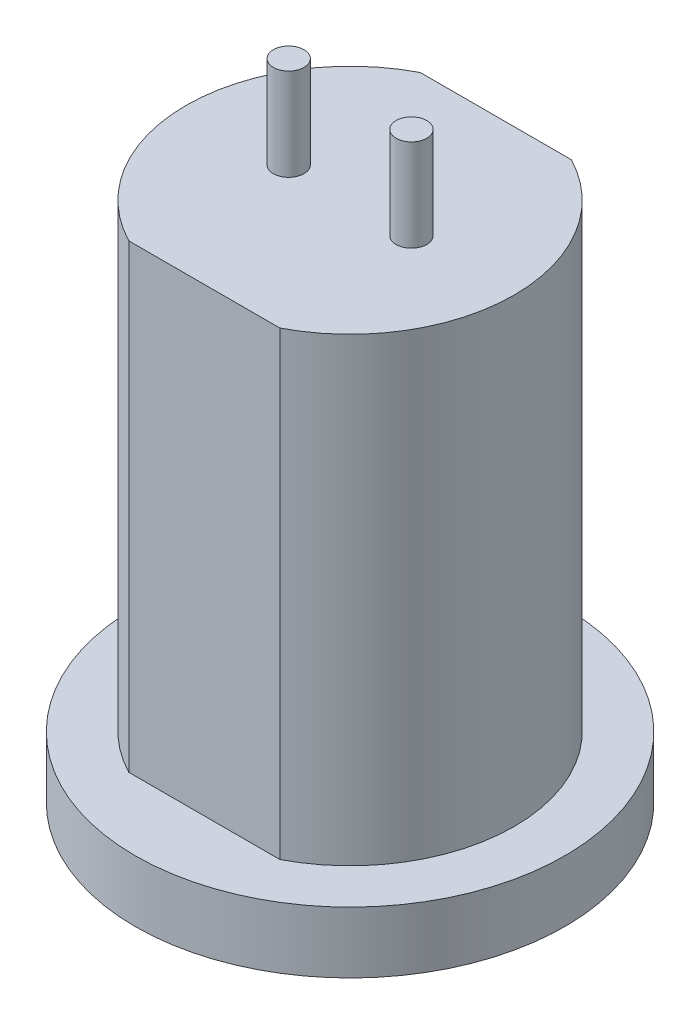
ISO-10303-21;
HEADER;
FILE_DESCRIPTION(('STEP AP214'),'2;1');
FILE_NAME('part.step','',(''),(''),'','','');
FILE_SCHEMA(('AUTOMOTIVE_DESIGN { 1 0 10303 214 1 1 1 1 }'));
ENDSEC;
DATA;
#1=APPLICATION_CONTEXT('core data for automotive mechanical design processes');
#2=APPLICATION_PROTOCOL_DEFINITION('international standard','automotive_design',2000,#1);
#3=PRODUCT_CONTEXT('',#1,'mechanical');
#4=PRODUCT('Part','Part','',(#3));
#5=PRODUCT_RELATED_PRODUCT_CATEGORY('part','',(#4));
#6=PRODUCT_DEFINITION_FORMATION('','',#4);
#7=PRODUCT_DEFINITION_CONTEXT('part definition',#1,'design');
#8=PRODUCT_DEFINITION('design','',#6,#7);
#9=PRODUCT_DEFINITION_SHAPE('','',#8);
#10=(LENGTH_UNIT() NAMED_UNIT(*) SI_UNIT(.MILLI.,.METRE.));
#11=(NAMED_UNIT(*) PLANE_ANGLE_UNIT() SI_UNIT($,.RADIAN.));
#12=(NAMED_UNIT(*) SI_UNIT($,.STERADIAN.) SOLID_ANGLE_UNIT());
#13=UNCERTAINTY_MEASURE_WITH_UNIT(LENGTH_MEASURE(1.E-05),#10,'distance_accuracy_value','');
#14=(GEOMETRIC_REPRESENTATION_CONTEXT(3) GLOBAL_UNCERTAINTY_ASSIGNED_CONTEXT((#13)) GLOBAL_UNIT_ASSIGNED_CONTEXT((#10,
#11,#12)) REPRESENTATION_CONTEXT('',''));
#15=CARTESIAN_POINT('',(0.,0.,0.));
#16=DIRECTION('',(0.,0.,1.));
#17=DIRECTION('',(1.,0.,0.));
#18=AXIS2_PLACEMENT_3D('',#15,#16,#17);
#19=CARTESIAN_POINT('',(0.,2.,0.));
#20=DIRECTION('',(0.,-1.,0.));
#21=DIRECTION('',(0.,0.,-1.));
#22=AXIS2_PLACEMENT_3D('',#19,#20,#21);
#23=CYLINDRICAL_SURFACE('',#22,7.);
#24=CARTESIAN_POINT('',(0.,2.,0.));
#25=DIRECTION('',(0.,1.,0.));
#26=DIRECTION('',(0.,0.,1.));
#27=AXIS2_PLACEMENT_3D('',#24,#25,#26);
#28=CIRCLE('',#27,7.);
#29=CARTESIAN_POINT('',(0.,2.,7.));
#30=VERTEX_POINT('',#29);
#31=EDGE_CURVE('E11',#30,#30,#28,.T.);
#32=ORIENTED_EDGE('',*,*,#31,.F.);
#33=EDGE_LOOP('',(#32));
#34=FACE_BOUND('',#33,.T.);
#35=CARTESIAN_POINT('',(0.,0.,0.));
#36=DIRECTION('',(0.,1.,0.));
#37=DIRECTION('',(0.,0.,1.));
#38=AXIS2_PLACEMENT_3D('',#35,#36,#37);
#39=CIRCLE('',#38,7.);
#40=CARTESIAN_POINT('',(0.,0.,7.));
#41=VERTEX_POINT('',#40);
#42=EDGE_CURVE('E42',#41,#41,#39,.T.);
#43=ORIENTED_EDGE('',*,*,#42,.T.);
#44=EDGE_LOOP('',(#43));
#45=FACE_BOUND('',#44,.T.);
#46=ADVANCED_FACE('F39',(#34,#45),#23,.T.);
#47=CARTESIAN_POINT('',(0.,2.,0.));
#48=DIRECTION('',(0.,1.,0.));
#49=DIRECTION('',(0.,0.,1.));
#50=AXIS2_PLACEMENT_3D('',#47,#48,#49);
#51=PLANE('',#50);
#52=CARTESIAN_POINT('',(0.,2.,0.));
#53=DIRECTION('',(0.,1.,0.));
#54=DIRECTION('',(0.,0.,1.));
#55=AXIS2_PLACEMENT_3D('',#52,#53,#54);
#56=CIRCLE('',#55,5.35);
#57=CARTESIAN_POINT('',(2.46170672501823,2.,4.74999999999999));
#58=VERTEX_POINT('',#57);
#59=CARTESIAN_POINT('',(2.46170672501819,2.,-4.75000000000001));
#60=VERTEX_POINT('',#59);
#61=EDGE_CURVE('E61',#58,#60,#56,.T.);
#62=ORIENTED_EDGE('',*,*,#61,.F.);
#63=DIRECTION('',(1.,0.,0.));
#64=VECTOR('',#63,1.);
#65=CARTESIAN_POINT('',(0.,2.,4.74999999999997));
#66=LINE('',#65,#64);
#67=CARTESIAN_POINT('',(-2.46170672501825,1.99999999999997,4.74999999999998));
#68=VERTEX_POINT('',#67);
#69=EDGE_CURVE('E158',#68,#58,#66,.T.);
#70=ORIENTED_EDGE('',*,*,#69,.F.);
#71=CARTESIAN_POINT('',(-2.46170672501825,2.00000000000003,-4.75000000000003));
#72=VERTEX_POINT('',#71);
#73=EDGE_CURVE('E167',#72,#68,#56,.T.);
#74=ORIENTED_EDGE('',*,*,#73,.F.);
#75=DIRECTION('',(1.,0.,0.));
#76=VECTOR('',#75,1.);
#77=CARTESIAN_POINT('',(0.,2.00000000000017,-4.75));
#78=LINE('',#77,#76);
#79=EDGE_CURVE('E166',#72,#60,#78,.T.);
#80=ORIENTED_EDGE('',*,*,#79,.T.);
#81=EDGE_LOOP('',(#62,#70,#74,#80));
#82=FACE_BOUND('',#81,.T.);
#83=ORIENTED_EDGE('',*,*,#31,.T.);
#84=EDGE_LOOP('',(#83));
#85=FACE_BOUND('',#84,.T.);
#86=ADVANCED_FACE('F187',(#82,#85),#51,.T.);
#87=CARTESIAN_POINT('',(0.,0.,0.));
#88=DIRECTION('',(0.,1.,0.));
#89=DIRECTION('',(0.,0.,1.));
#90=AXIS2_PLACEMENT_3D('',#87,#88,#89);
#91=PLANE('',#90);
#92=DIRECTION('',(1.,0.,0.));
#93=VECTOR('',#92,1.);
#94=CARTESIAN_POINT('',(-2.5,0.,-1.5));
#95=LINE('',#94,#93);
#96=CARTESIAN_POINT('',(-2.5,0.,-1.5));
#97=VERTEX_POINT('',#96);
#98=CARTESIAN_POINT('',(2.5,0.,-1.5));
#99=VERTEX_POINT('',#98);
#100=EDGE_CURVE('E134',#97,#99,#95,.T.);
#101=ORIENTED_EDGE('',*,*,#100,.F.);
#102=CARTESIAN_POINT('',(-2.5,0.,0.));
#103=DIRECTION('',(0.,-1.,0.));
#104=DIRECTION('',(0.,0.,-1.));
#105=AXIS2_PLACEMENT_3D('',#102,#103,#104);
#106=CIRCLE('',#105,1.5);
#107=CARTESIAN_POINT('',(-2.5,0.,1.5));
#108=VERTEX_POINT('',#107);
#109=EDGE_CURVE('E53',#108,#97,#106,.T.);
#110=ORIENTED_EDGE('',*,*,#109,.F.);
#111=DIRECTION('',(-1.,0.,0.));
#112=VECTOR('',#111,1.);
#113=CARTESIAN_POINT('',(-2.5,0.,1.5));
#114=LINE('',#113,#112);
#115=CARTESIAN_POINT('',(2.5,0.,1.5));
#116=VERTEX_POINT('',#115);
#117=EDGE_CURVE('E125',#116,#108,#114,.T.);
#118=ORIENTED_EDGE('',*,*,#117,.F.);
#119=CARTESIAN_POINT('',(2.5,0.,0.));
#120=DIRECTION('',(0.,-1.,0.));
#121=DIRECTION('',(0.,0.,-1.));
#122=AXIS2_PLACEMENT_3D('',#119,#120,#121);
#123=CIRCLE('',#122,1.5);
#124=EDGE_CURVE('E128',#99,#116,#123,.T.);
#125=ORIENTED_EDGE('',*,*,#124,.F.);
#126=EDGE_LOOP('',(#101,#110,#118,#125));
#127=FACE_BOUND('',#126,.T.);
#128=ORIENTED_EDGE('',*,*,#42,.F.);
#129=EDGE_LOOP('',(#128));
#130=FACE_BOUND('',#129,.T.);
#131=ADVANCED_FACE('F184',(#127,#130),#91,.F.);
#132=CARTESIAN_POINT('',(0.,17.,0.));
#133=DIRECTION('',(0.,-1.,0.));
#134=DIRECTION('',(0.,0.,-1.));
#135=AXIS2_PLACEMENT_3D('',#132,#133,#134);
#136=CYLINDRICAL_SURFACE('',#135,5.35);
#137=ORIENTED_EDGE('',*,*,#61,.T.);
#138=DIRECTION('',(0.,-1.,0.));
#139=VECTOR('',#138,1.);
#140=CARTESIAN_POINT('',(2.46170672501819,17.,-4.75000000000001));
#141=LINE('',#140,#139);
#142=CARTESIAN_POINT('',(2.46170672501819,17.,-4.75000000000001));
#143=VERTEX_POINT('',#142);
#144=EDGE_CURVE('E177',#143,#60,#141,.T.);
#145=ORIENTED_EDGE('',*,*,#144,.F.);
#146=CARTESIAN_POINT('',(0.,17.,0.));
#147=DIRECTION('',(0.,1.,0.));
#148=DIRECTION('',(0.,0.,1.));
#149=AXIS2_PLACEMENT_3D('',#146,#147,#148);
#150=CIRCLE('',#149,5.35);
#151=CARTESIAN_POINT('',(2.46170672501823,17.,4.74999999999999));
#152=VERTEX_POINT('',#151);
#153=EDGE_CURVE('E155',#152,#143,#150,.T.);
#154=ORIENTED_EDGE('',*,*,#153,.F.);
#155=DIRECTION('',(0.,-1.,0.));
#156=VECTOR('',#155,1.);
#157=CARTESIAN_POINT('',(2.46170672501823,17.,4.74999999999999));
#158=LINE('',#157,#156);
#159=EDGE_CURVE('E164',#152,#58,#158,.T.);
#160=ORIENTED_EDGE('',*,*,#159,.T.);
#161=EDGE_LOOP('',(#137,#145,#154,#160));
#162=FACE_BOUND('',#161,.T.);
#163=ADVANCED_FACE('F186',(#162),#136,.T.);
#164=CARTESIAN_POINT('',(0.,17.0000000000002,-4.75));
#165=DIRECTION('',(0.,0.,-1.));
#166=DIRECTION('',(-1.,0.,0.));
#167=AXIS2_PLACEMENT_3D('',#164,#165,#166);
#168=PLANE('',#167);
#169=ORIENTED_EDGE('',*,*,#79,.F.);
#170=DIRECTION('',(0.,-1.,0.));
#171=VECTOR('',#170,1.);
#172=CARTESIAN_POINT('',(-2.46170672501825,17.,-4.75000000000003));
#173=LINE('',#172,#171);
#174=CARTESIAN_POINT('',(-2.46170672501825,17.,-4.75000000000003));
#175=VERTEX_POINT('',#174);
#176=EDGE_CURVE('E175',#175,#72,#173,.T.);
#177=ORIENTED_EDGE('',*,*,#176,.F.);
#178=DIRECTION('',(1.,0.,0.));
#179=VECTOR('',#178,1.);
#180=CARTESIAN_POINT('',(0.,17.0000000000002,-4.75));
#181=LINE('',#180,#179);
#182=EDGE_CURVE('E157',#175,#143,#181,.T.);
#183=ORIENTED_EDGE('',*,*,#182,.T.);
#184=ORIENTED_EDGE('',*,*,#144,.T.);
#185=EDGE_LOOP('',(#169,#177,#183,#184));
#186=FACE_BOUND('',#185,.T.);
#187=ADVANCED_FACE('F193',(#186),#168,.T.);
#188=ORIENTED_EDGE('',*,*,#73,.T.);
#189=DIRECTION('',(0.,-1.,0.));
#190=VECTOR('',#189,1.);
#191=CARTESIAN_POINT('',(-2.46170672501825,17.,4.74999999999998));
#192=LINE('',#191,#190);
#193=CARTESIAN_POINT('',(-2.46170672501825,17.,4.74999999999998));
#194=VERTEX_POINT('',#193);
#195=EDGE_CURVE('E172',#194,#68,#192,.T.);
#196=ORIENTED_EDGE('',*,*,#195,.F.);
#197=EDGE_CURVE('E159',#175,#194,#150,.T.);
#198=ORIENTED_EDGE('',*,*,#197,.F.);
#199=ORIENTED_EDGE('',*,*,#176,.T.);
#200=EDGE_LOOP('',(#188,#196,#198,#199));
#201=FACE_BOUND('',#200,.T.);
#202=ADVANCED_FACE('F195',(#201),#136,.T.);
#203=CARTESIAN_POINT('',(0.,17.,4.74999999999997));
#204=DIRECTION('',(0.,0.,-1.));
#205=DIRECTION('',(-1.,0.,0.));
#206=AXIS2_PLACEMENT_3D('',#203,#204,#205);
#207=PLANE('',#206);
#208=ORIENTED_EDGE('',*,*,#69,.T.);
#209=ORIENTED_EDGE('',*,*,#159,.F.);
#210=DIRECTION('',(1.,0.,0.));
#211=VECTOR('',#210,1.);
#212=CARTESIAN_POINT('',(0.,17.,4.74999999999997));
#213=LINE('',#212,#211);
#214=EDGE_CURVE('E162',#194,#152,#213,.T.);
#215=ORIENTED_EDGE('',*,*,#214,.F.);
#216=ORIENTED_EDGE('',*,*,#195,.T.);
#217=EDGE_LOOP('',(#208,#209,#215,#216));
#218=FACE_BOUND('',#217,.T.);
#219=ADVANCED_FACE('F235',(#218),#207,.F.);
#220=CARTESIAN_POINT('',(0.,17.,0.));
#221=DIRECTION('',(0.,1.,0.));
#222=DIRECTION('',(0.,0.,1.));
#223=AXIS2_PLACEMENT_3D('',#220,#221,#222);
#224=PLANE('',#223);
#225=CARTESIAN_POINT('',(2.,17.,0.));
#226=DIRECTION('',(0.,1.,0.));
#227=DIRECTION('',(0.,0.,1.));
#228=AXIS2_PLACEMENT_3D('',#225,#226,#227);
#229=CIRCLE('',#228,0.5);
#230=CARTESIAN_POINT('',(2.,17.,0.499999999999966));
#231=VERTEX_POINT('',#230);
#232=EDGE_CURVE('E144',#231,#231,#229,.T.);
#233=ORIENTED_EDGE('',*,*,#232,.F.);
#234=EDGE_LOOP('',(#233));
#235=FACE_BOUND('',#234,.T.);
#236=CARTESIAN_POINT('',(-2.,17.,0.));
#237=DIRECTION('',(0.,1.,0.));
#238=DIRECTION('',(0.,0.,1.));
#239=AXIS2_PLACEMENT_3D('',#236,#237,#238);
#240=CIRCLE('',#239,0.5);
#241=CARTESIAN_POINT('',(-2.,17.,0.499999999999966));
#242=VERTEX_POINT('',#241);
#243=EDGE_CURVE('E147',#242,#242,#240,.T.);
#244=ORIENTED_EDGE('',*,*,#243,.F.);
#245=EDGE_LOOP('',(#244));
#246=FACE_BOUND('',#245,.T.);
#247=ORIENTED_EDGE('',*,*,#153,.T.);
#248=ORIENTED_EDGE('',*,*,#182,.F.);
#249=ORIENTED_EDGE('',*,*,#197,.T.);
#250=ORIENTED_EDGE('',*,*,#214,.T.);
#251=EDGE_LOOP('',(#247,#248,#249,#250));
#252=FACE_BOUND('',#251,.T.);
#253=ADVANCED_FACE('F245',(#235,#246,#252),#224,.T.);
#254=CARTESIAN_POINT('',(-2.,20.,0.));
#255=DIRECTION('',(0.,-1.,0.));
#256=DIRECTION('',(0.,0.,-1.));
#257=AXIS2_PLACEMENT_3D('',#254,#255,#256);
#258=CYLINDRICAL_SURFACE('',#257,0.5);
#259=CARTESIAN_POINT('',(-2.,20.,0.));
#260=DIRECTION('',(0.,1.,0.));
#261=DIRECTION('',(0.,0.,1.));
#262=AXIS2_PLACEMENT_3D('',#259,#260,#261);
#263=CIRCLE('',#262,0.5);
#264=CARTESIAN_POINT('',(-2.,20.,0.49999999999996));
#265=VERTEX_POINT('',#264);
#266=EDGE_CURVE('E150',#265,#265,#263,.T.);
#267=ORIENTED_EDGE('',*,*,#266,.F.);
#268=EDGE_LOOP('',(#267));
#269=FACE_BOUND('',#268,.T.);
#270=ORIENTED_EDGE('',*,*,#243,.T.);
#271=EDGE_LOOP('',(#270));
#272=FACE_BOUND('',#271,.T.);
#273=ADVANCED_FACE('F256',(#269,#272),#258,.T.);
#274=CARTESIAN_POINT('',(-2.,20.,0.));
#275=DIRECTION('',(0.,1.,0.));
#276=DIRECTION('',(0.,0.,1.));
#277=AXIS2_PLACEMENT_3D('',#274,#275,#276);
#278=PLANE('',#277);
#279=ORIENTED_EDGE('',*,*,#266,.T.);
#280=EDGE_LOOP('',(#279));
#281=FACE_BOUND('',#280,.T.);
#282=ADVANCED_FACE('F267',(#281),#278,.T.);
#283=CARTESIAN_POINT('',(2.,20.,0.));
#284=DIRECTION('',(0.,-1.,0.));
#285=DIRECTION('',(0.,0.,-1.));
#286=AXIS2_PLACEMENT_3D('',#283,#284,#285);
#287=CYLINDRICAL_SURFACE('',#286,0.5);
#288=CARTESIAN_POINT('',(2.,20.,0.));
#289=DIRECTION('',(0.,1.,0.));
#290=DIRECTION('',(0.,0.,1.));
#291=AXIS2_PLACEMENT_3D('',#288,#289,#290);
#292=CIRCLE('',#291,0.5);
#293=CARTESIAN_POINT('',(2.,20.,0.49999999999996));
#294=VERTEX_POINT('',#293);
#295=EDGE_CURVE('E140',#294,#294,#292,.T.);
#296=ORIENTED_EDGE('',*,*,#295,.F.);
#297=EDGE_LOOP('',(#296));
#298=FACE_BOUND('',#297,.T.);
#299=ORIENTED_EDGE('',*,*,#232,.T.);
#300=EDGE_LOOP('',(#299));
#301=FACE_BOUND('',#300,.T.);
#302=ADVANCED_FACE('F278',(#298,#301),#287,.T.);
#303=CARTESIAN_POINT('',(2.,20.,0.));
#304=DIRECTION('',(0.,1.,0.));
#305=DIRECTION('',(0.,0.,1.));
#306=AXIS2_PLACEMENT_3D('',#303,#304,#305);
#307=PLANE('',#306);
#308=ORIENTED_EDGE('',*,*,#295,.T.);
#309=EDGE_LOOP('',(#308));
#310=FACE_BOUND('',#309,.T.);
#311=ADVANCED_FACE('F289',(#310),#307,.T.);
#312=CARTESIAN_POINT('',(-2.5,5.,0.));
#313=DIRECTION('',(0.,-1.,0.));
#314=DIRECTION('',(0.,0.,-1.));
#315=AXIS2_PLACEMENT_3D('',#312,#313,#314);
#316=CYLINDRICAL_SURFACE('',#315,1.5);
#317=ORIENTED_EDGE('',*,*,#109,.T.);
#318=DIRECTION('',(0.,-1.,0.));
#319=VECTOR('',#318,1.);
#320=CARTESIAN_POINT('',(-2.5,5.,-1.5));
#321=LINE('',#320,#319);
#322=CARTESIAN_POINT('',(-2.5,5.,-1.5));
#323=VERTEX_POINT('',#322);
#324=EDGE_CURVE('E103',#323,#97,#321,.T.);
#325=ORIENTED_EDGE('',*,*,#324,.F.);
#326=CARTESIAN_POINT('',(-2.5,5.,0.));
#327=DIRECTION('',(0.,-1.,0.));
#328=DIRECTION('',(0.,0.,-1.));
#329=AXIS2_PLACEMENT_3D('',#326,#327,#328);
#330=CIRCLE('',#329,1.5);
#331=CARTESIAN_POINT('',(-2.5,5.,1.5));
#332=VERTEX_POINT('',#331);
#333=EDGE_CURVE('E107',#332,#323,#330,.T.);
#334=ORIENTED_EDGE('',*,*,#333,.F.);
#335=DIRECTION('',(0.,-1.,0.));
#336=VECTOR('',#335,1.);
#337=CARTESIAN_POINT('',(-2.5,5.,1.5));
#338=LINE('',#337,#336);
#339=EDGE_CURVE('E138',#332,#108,#338,.T.);
#340=ORIENTED_EDGE('',*,*,#339,.T.);
#341=EDGE_LOOP('',(#317,#325,#334,#340));
#342=FACE_BOUND('',#341,.T.);
#343=ADVANCED_FACE('F105',(#342),#316,.F.);
#344=CARTESIAN_POINT('',(-2.5,5.,1.5));
#345=DIRECTION('',(0.,0.,1.));
#346=DIRECTION('',(1.,0.,0.));
#347=AXIS2_PLACEMENT_3D('',#344,#345,#346);
#348=PLANE('',#347);
#349=ORIENTED_EDGE('',*,*,#117,.T.);
#350=ORIENTED_EDGE('',*,*,#339,.F.);
#351=DIRECTION('',(-1.,0.,0.));
#352=VECTOR('',#351,1.);
#353=CARTESIAN_POINT('',(-2.5,5.,1.5));
#354=LINE('',#353,#352);
#355=CARTESIAN_POINT('',(2.5,5.,1.5));
#356=VERTEX_POINT('',#355);
#357=EDGE_CURVE('E113',#356,#332,#354,.T.);
#358=ORIENTED_EDGE('',*,*,#357,.F.);
#359=DIRECTION('',(0.,-1.,0.));
#360=VECTOR('',#359,1.);
#361=CARTESIAN_POINT('',(2.5,5.,1.5));
#362=LINE('',#361,#360);
#363=EDGE_CURVE('E141',#356,#116,#362,.T.);
#364=ORIENTED_EDGE('',*,*,#363,.T.);
#365=EDGE_LOOP('',(#349,#350,#358,#364));
#366=FACE_BOUND('',#365,.T.);
#367=ADVANCED_FACE('F314',(#366),#348,.F.);
#368=CARTESIAN_POINT('',(2.5,5.,0.));
#369=DIRECTION('',(0.,-1.,0.));
#370=DIRECTION('',(0.,0.,-1.));
#371=AXIS2_PLACEMENT_3D('',#368,#369,#370);
#372=CYLINDRICAL_SURFACE('',#371,1.5);
#373=ORIENTED_EDGE('',*,*,#124,.T.);
#374=ORIENTED_EDGE('',*,*,#363,.F.);
#375=CARTESIAN_POINT('',(2.5,5.,0.));
#376=DIRECTION('',(0.,-1.,0.));
#377=DIRECTION('',(0.,0.,-1.));
#378=AXIS2_PLACEMENT_3D('',#375,#376,#377);
#379=CIRCLE('',#378,1.5);
#380=CARTESIAN_POINT('',(2.5,5.,-1.5));
#381=VERTEX_POINT('',#380);
#382=EDGE_CURVE('E121',#381,#356,#379,.T.);
#383=ORIENTED_EDGE('',*,*,#382,.F.);
#384=DIRECTION('',(0.,-1.,0.));
#385=VECTOR('',#384,1.);
#386=CARTESIAN_POINT('',(2.5,5.,-1.5));
#387=LINE('',#386,#385);
#388=EDGE_CURVE('E112',#381,#99,#387,.T.);
#389=ORIENTED_EDGE('',*,*,#388,.T.);
#390=EDGE_LOOP('',(#373,#374,#383,#389));
#391=FACE_BOUND('',#390,.T.);
#392=ADVANCED_FACE('F324',(#391),#372,.F.);
#393=CARTESIAN_POINT('',(-2.5,5.,-1.5));
#394=DIRECTION('',(0.,0.,-1.));
#395=DIRECTION('',(-1.,0.,0.));
#396=AXIS2_PLACEMENT_3D('',#393,#394,#395);
#397=PLANE('',#396);
#398=ORIENTED_EDGE('',*,*,#100,.T.);
#399=ORIENTED_EDGE('',*,*,#388,.F.);
#400=DIRECTION('',(1.,0.,0.));
#401=VECTOR('',#400,1.);
#402=CARTESIAN_POINT('',(-2.5,5.,-1.5));
#403=LINE('',#402,#401);
#404=EDGE_CURVE('E116',#323,#381,#403,.T.);
#405=ORIENTED_EDGE('',*,*,#404,.F.);
#406=ORIENTED_EDGE('',*,*,#324,.T.);
#407=EDGE_LOOP('',(#398,#399,#405,#406));
#408=FACE_BOUND('',#407,.T.);
#409=ADVANCED_FACE('F117',(#408),#397,.F.);
#410=CARTESIAN_POINT('',(-2.5,5.,0.));
#411=DIRECTION('',(0.,-1.,0.));
#412=DIRECTION('',(0.,0.,-1.));
#413=AXIS2_PLACEMENT_3D('',#410,#411,#412);
#414=PLANE('',#413);
#415=ORIENTED_EDGE('',*,*,#333,.T.);
#416=ORIENTED_EDGE('',*,*,#404,.T.);
#417=ORIENTED_EDGE('',*,*,#382,.T.);
#418=ORIENTED_EDGE('',*,*,#357,.T.);
#419=EDGE_LOOP('',(#415,#416,#417,#418));
#420=FACE_BOUND('',#419,.T.);
#421=ADVANCED_FACE('F123',(#420),#414,.T.);
#422=CLOSED_SHELL('',(#46,#86,#131,#163,#187,#202,#219,#253,#273,#282,#302,#311,#343,#367,#392,
#409,#421));
#423=MANIFOLD_SOLID_BREP('B2',#422);
#424=ADVANCED_BREP_SHAPE_REPRESENTATION('',(#18,#423),#14);
#425=SHAPE_DEFINITION_REPRESENTATION(#9,#424);
ENDSEC;
END-ISO-10303-21;
